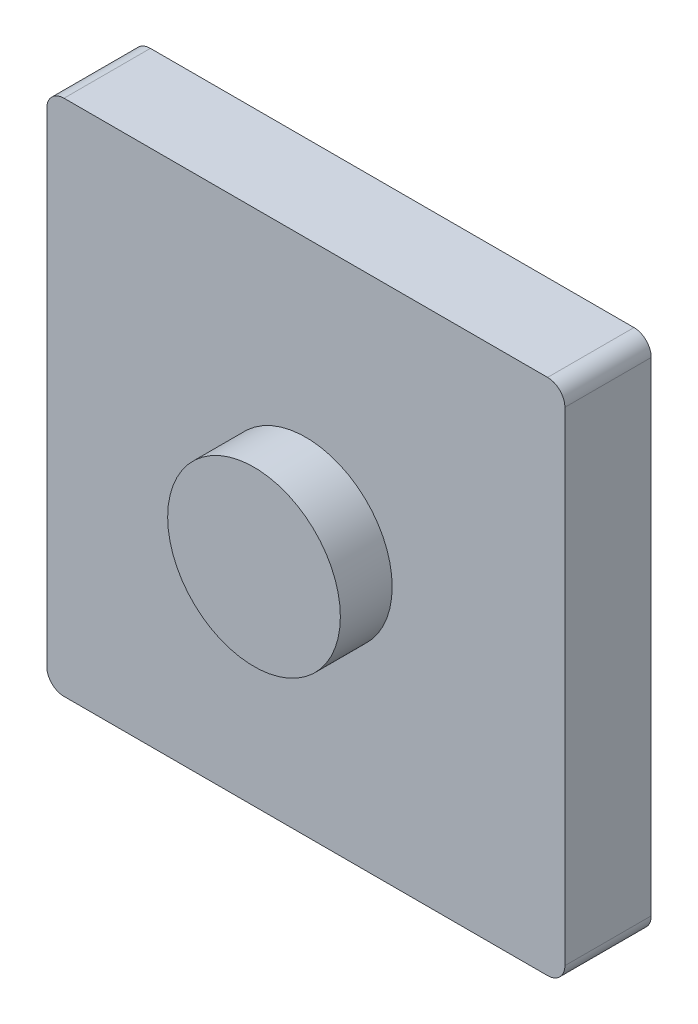
ISO-10303-21;
HEADER;
FILE_DESCRIPTION(('STEP AP214'),'2;1');
FILE_NAME('part.step','',(''),(''),'','','');
FILE_SCHEMA(('AUTOMOTIVE_DESIGN { 1 0 10303 214 1 1 1 1 }'));
ENDSEC;
DATA;
#1=APPLICATION_CONTEXT('core data for automotive mechanical design processes');
#2=APPLICATION_PROTOCOL_DEFINITION('international standard','automotive_design',2000,#1);
#3=PRODUCT_CONTEXT('',#1,'mechanical');
#4=PRODUCT('Part','Part','',(#3));
#5=PRODUCT_RELATED_PRODUCT_CATEGORY('part','',(#4));
#6=PRODUCT_DEFINITION_FORMATION('','',#4);
#7=PRODUCT_DEFINITION_CONTEXT('part definition',#1,'design');
#8=PRODUCT_DEFINITION('design','',#6,#7);
#9=PRODUCT_DEFINITION_SHAPE('','',#8);
#10=(LENGTH_UNIT() NAMED_UNIT(*) SI_UNIT(.MILLI.,.METRE.));
#11=(NAMED_UNIT(*) PLANE_ANGLE_UNIT() SI_UNIT($,.RADIAN.));
#12=(NAMED_UNIT(*) SI_UNIT($,.STERADIAN.) SOLID_ANGLE_UNIT());
#13=UNCERTAINTY_MEASURE_WITH_UNIT(LENGTH_MEASURE(1.E-05),#10,'distance_accuracy_value','');
#14=(GEOMETRIC_REPRESENTATION_CONTEXT(3) GLOBAL_UNCERTAINTY_ASSIGNED_CONTEXT((#13)) GLOBAL_UNIT_ASSIGNED_CONTEXT((#10,
#11,#12)) REPRESENTATION_CONTEXT('',''));
#15=CARTESIAN_POINT('',(0.,0.,0.));
#16=DIRECTION('',(0.,0.,1.));
#17=DIRECTION('',(1.,0.,0.));
#18=AXIS2_PLACEMENT_3D('',#15,#16,#17);
#19=CARTESIAN_POINT('',(1.,1.,5.));
#20=DIRECTION('',(0.,0.,-1.));
#21=DIRECTION('',(-1.,0.,0.));
#22=AXIS2_PLACEMENT_3D('',#19,#20,#21);
#23=CYLINDRICAL_SURFACE('',#22,1.);
#24=CARTESIAN_POINT('',(1.,1.,0.));
#25=DIRECTION('',(0.,0.,1.));
#26=DIRECTION('',(-1.,0.,0.));
#27=AXIS2_PLACEMENT_3D('',#24,#25,#26);
#28=CIRCLE('',#27,1.);
#29=CARTESIAN_POINT('',(0.,1.00000000000001,0.));
#30=VERTEX_POINT('',#29);
#31=CARTESIAN_POINT('',(1.00000000000001,0.,0.));
#32=VERTEX_POINT('',#31);
#33=EDGE_CURVE('E131',#30,#32,#28,.T.);
#34=ORIENTED_EDGE('',*,*,#33,.T.);
#35=DIRECTION('',(0.,0.,-1.));
#36=VECTOR('',#35,1.);
#37=CARTESIAN_POINT('',(1.00000000000001,0.,5.));
#38=LINE('',#37,#36);
#39=CARTESIAN_POINT('',(1.00000000000001,0.,5.));
#40=VERTEX_POINT('',#39);
#41=EDGE_CURVE('E42',#40,#32,#38,.T.);
#42=ORIENTED_EDGE('',*,*,#41,.F.);
#43=CARTESIAN_POINT('',(1.,1.,5.));
#44=DIRECTION('',(0.,0.,1.));
#45=DIRECTION('',(-1.,0.,0.));
#46=AXIS2_PLACEMENT_3D('',#43,#44,#45);
#47=CIRCLE('',#46,1.);
#48=CARTESIAN_POINT('',(0.,1.00000000000001,5.));
#49=VERTEX_POINT('',#48);
#50=EDGE_CURVE('E146',#49,#40,#47,.T.);
#51=ORIENTED_EDGE('',*,*,#50,.F.);
#52=DIRECTION('',(0.,0.,-1.));
#53=VECTOR('',#52,1.);
#54=CARTESIAN_POINT('',(0.,1.00000000000001,5.));
#55=LINE('',#54,#53);
#56=EDGE_CURVE('E127',#49,#30,#55,.T.);
#57=ORIENTED_EDGE('',*,*,#56,.T.);
#58=EDGE_LOOP('',(#34,#42,#51,#57));
#59=FACE_BOUND('',#58,.T.);
#60=ADVANCED_FACE('F34',(#59),#23,.T.);
#61=CARTESIAN_POINT('',(1.00000000000001,0.,5.));
#62=DIRECTION('',(0.,1.,0.));
#63=DIRECTION('',(0.,0.,1.));
#64=AXIS2_PLACEMENT_3D('',#61,#62,#63);
#65=PLANE('',#64);
#66=DIRECTION('',(1.,0.,0.));
#67=VECTOR('',#66,1.);
#68=CARTESIAN_POINT('',(1.00000000000001,0.,0.));
#69=LINE('',#68,#67);
#70=CARTESIAN_POINT('',(29.,0.,0.));
#71=VERTEX_POINT('',#70);
#72=EDGE_CURVE('E134',#32,#71,#69,.T.);
#73=ORIENTED_EDGE('',*,*,#72,.T.);
#74=DIRECTION('',(0.,0.,-1.));
#75=VECTOR('',#74,1.);
#76=CARTESIAN_POINT('',(29.,0.,5.));
#77=LINE('',#76,#75);
#78=CARTESIAN_POINT('',(29.,0.,5.));
#79=VERTEX_POINT('',#78);
#80=EDGE_CURVE('E156',#79,#71,#77,.T.);
#81=ORIENTED_EDGE('',*,*,#80,.F.);
#82=DIRECTION('',(1.,0.,0.));
#83=VECTOR('',#82,1.);
#84=CARTESIAN_POINT('',(1.00000000000001,0.,5.));
#85=LINE('',#84,#83);
#86=EDGE_CURVE('E94',#40,#79,#85,.T.);
#87=ORIENTED_EDGE('',*,*,#86,.F.);
#88=ORIENTED_EDGE('',*,*,#41,.T.);
#89=EDGE_LOOP('',(#73,#81,#87,#88));
#90=FACE_BOUND('',#89,.T.);
#91=ADVANCED_FACE('F159',(#90),#65,.F.);
#92=CARTESIAN_POINT('',(29.,1.,5.));
#93=DIRECTION('',(0.,0.,-1.));
#94=DIRECTION('',(-1.,0.,0.));
#95=AXIS2_PLACEMENT_3D('',#92,#93,#94);
#96=CYLINDRICAL_SURFACE('',#95,1.);
#97=CARTESIAN_POINT('',(29.,1.,0.));
#98=DIRECTION('',(0.,0.,1.));
#99=DIRECTION('',(1.,0.,0.));
#100=AXIS2_PLACEMENT_3D('',#97,#98,#99);
#101=CIRCLE('',#100,1.);
#102=CARTESIAN_POINT('',(30.,1.,0.));
#103=VERTEX_POINT('',#102);
#104=EDGE_CURVE('E137',#71,#103,#101,.T.);
#105=ORIENTED_EDGE('',*,*,#104,.T.);
#106=DIRECTION('',(0.,0.,-1.));
#107=VECTOR('',#106,1.);
#108=CARTESIAN_POINT('',(30.,1.,5.));
#109=LINE('',#108,#107);
#110=CARTESIAN_POINT('',(30.,1.,5.));
#111=VERTEX_POINT('',#110);
#112=EDGE_CURVE('E153',#111,#103,#109,.T.);
#113=ORIENTED_EDGE('',*,*,#112,.F.);
#114=CARTESIAN_POINT('',(29.,1.,5.));
#115=DIRECTION('',(0.,0.,1.));
#116=DIRECTION('',(1.,0.,0.));
#117=AXIS2_PLACEMENT_3D('',#114,#115,#116);
#118=CIRCLE('',#117,1.);
#119=EDGE_CURVE('E177',#79,#111,#118,.T.);
#120=ORIENTED_EDGE('',*,*,#119,.F.);
#121=ORIENTED_EDGE('',*,*,#80,.T.);
#122=EDGE_LOOP('',(#105,#113,#120,#121));
#123=FACE_BOUND('',#122,.T.);
#124=ADVANCED_FACE('F170',(#123),#96,.T.);
#125=CARTESIAN_POINT('',(30.,1.00000000000001,5.));
#126=DIRECTION('',(-1.,0.,0.));
#127=DIRECTION('',(0.,0.,1.));
#128=AXIS2_PLACEMENT_3D('',#125,#126,#127);
#129=PLANE('',#128);
#130=DIRECTION('',(0.,1.,0.));
#131=VECTOR('',#130,1.);
#132=CARTESIAN_POINT('',(30.,1.00000000000001,0.));
#133=LINE('',#132,#131);
#134=CARTESIAN_POINT('',(30.,29.,0.));
#135=VERTEX_POINT('',#134);
#136=EDGE_CURVE('E139',#103,#135,#133,.T.);
#137=ORIENTED_EDGE('',*,*,#136,.T.);
#138=DIRECTION('',(0.,0.,-1.));
#139=VECTOR('',#138,1.);
#140=CARTESIAN_POINT('',(30.,29.,5.));
#141=LINE('',#140,#139);
#142=CARTESIAN_POINT('',(30.,29.,5.));
#143=VERTEX_POINT('',#142);
#144=EDGE_CURVE('E150',#143,#135,#141,.T.);
#145=ORIENTED_EDGE('',*,*,#144,.F.);
#146=DIRECTION('',(0.,1.,0.));
#147=VECTOR('',#146,1.);
#148=CARTESIAN_POINT('',(30.,1.00000000000001,5.));
#149=LINE('',#148,#147);
#150=EDGE_CURVE('E176',#111,#143,#149,.T.);
#151=ORIENTED_EDGE('',*,*,#150,.F.);
#152=ORIENTED_EDGE('',*,*,#112,.T.);
#153=EDGE_LOOP('',(#137,#145,#151,#152));
#154=FACE_BOUND('',#153,.T.);
#155=ADVANCED_FACE('F174',(#154),#129,.F.);
#156=CARTESIAN_POINT('',(29.,29.,5.));
#157=DIRECTION('',(0.,0.,-1.));
#158=DIRECTION('',(-1.,0.,0.));
#159=AXIS2_PLACEMENT_3D('',#156,#157,#158);
#160=CYLINDRICAL_SURFACE('',#159,1.);
#161=CARTESIAN_POINT('',(29.,29.,0.));
#162=DIRECTION('',(0.,0.,1.));
#163=DIRECTION('',(-1.,0.,0.));
#164=AXIS2_PLACEMENT_3D('',#161,#162,#163);
#165=CIRCLE('',#164,1.);
#166=CARTESIAN_POINT('',(29.,30.,0.));
#167=VERTEX_POINT('',#166);
#168=EDGE_CURVE('E141',#135,#167,#165,.T.);
#169=ORIENTED_EDGE('',*,*,#168,.T.);
#170=DIRECTION('',(0.,0.,-1.));
#171=VECTOR('',#170,1.);
#172=CARTESIAN_POINT('',(29.,30.,5.));
#173=LINE('',#172,#171);
#174=CARTESIAN_POINT('',(29.,30.,5.));
#175=VERTEX_POINT('',#174);
#176=EDGE_CURVE('E122',#175,#167,#173,.T.);
#177=ORIENTED_EDGE('',*,*,#176,.F.);
#178=CARTESIAN_POINT('',(29.,29.,5.));
#179=DIRECTION('',(0.,0.,1.));
#180=DIRECTION('',(-1.,0.,0.));
#181=AXIS2_PLACEMENT_3D('',#178,#179,#180);
#182=CIRCLE('',#181,1.);
#183=EDGE_CURVE('E113',#143,#175,#182,.T.);
#184=ORIENTED_EDGE('',*,*,#183,.F.);
#185=ORIENTED_EDGE('',*,*,#144,.T.);
#186=EDGE_LOOP('',(#169,#177,#184,#185));
#187=FACE_BOUND('',#186,.T.);
#188=ADVANCED_FACE('F214',(#187),#160,.T.);
#189=CARTESIAN_POINT('',(1.00000000000001,30.,5.));
#190=DIRECTION('',(0.,-1.,0.));
#191=DIRECTION('',(0.,0.,-1.));
#192=AXIS2_PLACEMENT_3D('',#189,#190,#191);
#193=PLANE('',#192);
#194=DIRECTION('',(-1.,0.,0.));
#195=VECTOR('',#194,1.);
#196=CARTESIAN_POINT('',(1.00000000000001,30.,0.));
#197=LINE('',#196,#195);
#198=CARTESIAN_POINT('',(1.00000000000001,30.,0.));
#199=VERTEX_POINT('',#198);
#200=EDGE_CURVE('E121',#167,#199,#197,.T.);
#201=ORIENTED_EDGE('',*,*,#200,.T.);
#202=DIRECTION('',(0.,0.,-1.));
#203=VECTOR('',#202,1.);
#204=CARTESIAN_POINT('',(1.00000000000001,30.,5.));
#205=LINE('',#204,#203);
#206=CARTESIAN_POINT('',(1.00000000000001,30.,5.));
#207=VERTEX_POINT('',#206);
#208=EDGE_CURVE('E118',#207,#199,#205,.T.);
#209=ORIENTED_EDGE('',*,*,#208,.F.);
#210=DIRECTION('',(-1.,0.,0.));
#211=VECTOR('',#210,1.);
#212=CARTESIAN_POINT('',(1.00000000000001,30.,5.));
#213=LINE('',#212,#211);
#214=EDGE_CURVE('E107',#175,#207,#213,.T.);
#215=ORIENTED_EDGE('',*,*,#214,.F.);
#216=ORIENTED_EDGE('',*,*,#176,.T.);
#217=EDGE_LOOP('',(#201,#209,#215,#216));
#218=FACE_BOUND('',#217,.T.);
#219=ADVANCED_FACE('F119',(#218),#193,.F.);
#220=CARTESIAN_POINT('',(1.,29.,5.));
#221=DIRECTION('',(0.,0.,-1.));
#222=DIRECTION('',(-1.,0.,0.));
#223=AXIS2_PLACEMENT_3D('',#220,#221,#222);
#224=CYLINDRICAL_SURFACE('',#223,1.);
#225=CARTESIAN_POINT('',(1.,29.,0.));
#226=DIRECTION('',(0.,0.,1.));
#227=DIRECTION('',(-1.,0.,0.));
#228=AXIS2_PLACEMENT_3D('',#225,#226,#227);
#229=CIRCLE('',#228,1.);
#230=CARTESIAN_POINT('',(0.,29.,0.));
#231=VERTEX_POINT('',#230);
#232=EDGE_CURVE('E79',#199,#231,#229,.T.);
#233=ORIENTED_EDGE('',*,*,#232,.T.);
#234=DIRECTION('',(0.,0.,-1.));
#235=VECTOR('',#234,1.);
#236=CARTESIAN_POINT('',(0.,29.,5.));
#237=LINE('',#236,#235);
#238=CARTESIAN_POINT('',(0.,29.,5.));
#239=VERTEX_POINT('',#238);
#240=EDGE_CURVE('E123',#239,#231,#237,.T.);
#241=ORIENTED_EDGE('',*,*,#240,.F.);
#242=CARTESIAN_POINT('',(1.,29.,5.));
#243=DIRECTION('',(0.,0.,1.));
#244=DIRECTION('',(-1.,0.,0.));
#245=AXIS2_PLACEMENT_3D('',#242,#243,#244);
#246=CIRCLE('',#245,1.);
#247=EDGE_CURVE('E111',#207,#239,#246,.T.);
#248=ORIENTED_EDGE('',*,*,#247,.F.);
#249=ORIENTED_EDGE('',*,*,#208,.T.);
#250=EDGE_LOOP('',(#233,#241,#248,#249));
#251=FACE_BOUND('',#250,.T.);
#252=ADVANCED_FACE('F125',(#251),#224,.T.);
#253=CARTESIAN_POINT('',(0.,1.00000000000001,5.));
#254=DIRECTION('',(1.,0.,0.));
#255=DIRECTION('',(0.,0.,-1.));
#256=AXIS2_PLACEMENT_3D('',#253,#254,#255);
#257=PLANE('',#256);
#258=DIRECTION('',(0.,-1.,0.));
#259=VECTOR('',#258,1.);
#260=CARTESIAN_POINT('',(0.,1.00000000000001,0.));
#261=LINE('',#260,#259);
#262=EDGE_CURVE('E85',#231,#30,#261,.T.);
#263=ORIENTED_EDGE('',*,*,#262,.T.);
#264=ORIENTED_EDGE('',*,*,#56,.F.);
#265=DIRECTION('',(0.,-1.,0.));
#266=VECTOR('',#265,1.);
#267=CARTESIAN_POINT('',(0.,1.00000000000001,5.));
#268=LINE('',#267,#266);
#269=EDGE_CURVE('E50',#239,#49,#268,.T.);
#270=ORIENTED_EDGE('',*,*,#269,.F.);
#271=ORIENTED_EDGE('',*,*,#240,.T.);
#272=EDGE_LOOP('',(#263,#264,#270,#271));
#273=FACE_BOUND('',#272,.T.);
#274=ADVANCED_FACE('F195',(#273),#257,.F.);
#275=CARTESIAN_POINT('',(1.,1.,5.));
#276=DIRECTION('',(0.,0.,-1.));
#277=DIRECTION('',(-1.,0.,0.));
#278=AXIS2_PLACEMENT_3D('',#275,#276,#277);
#279=PLANE('',#278);
#280=CARTESIAN_POINT('',(15.,15.,5.));
#281=DIRECTION('',(0.,0.,-1.));
#282=DIRECTION('',(-1.,0.,0.));
#283=AXIS2_PLACEMENT_3D('',#280,#281,#282);
#284=CIRCLE('',#283,5.);
#285=CARTESIAN_POINT('',(10.,15.,5.));
#286=VERTEX_POINT('',#285);
#287=EDGE_CURVE('E11',#286,#286,#284,.F.);
#288=ORIENTED_EDGE('',*,*,#287,.F.);
#289=EDGE_LOOP('',(#288));
#290=FACE_BOUND('',#289,.T.);
#291=ORIENTED_EDGE('',*,*,#50,.T.);
#292=ORIENTED_EDGE('',*,*,#86,.T.);
#293=ORIENTED_EDGE('',*,*,#119,.T.);
#294=ORIENTED_EDGE('',*,*,#150,.T.);
#295=ORIENTED_EDGE('',*,*,#183,.T.);
#296=ORIENTED_EDGE('',*,*,#214,.T.);
#297=ORIENTED_EDGE('',*,*,#247,.T.);
#298=ORIENTED_EDGE('',*,*,#269,.T.);
#299=EDGE_LOOP('',(#291,#292,#293,#294,#295,#296,#297,#298));
#300=FACE_BOUND('',#299,.T.);
#301=ADVANCED_FACE('F109',(#290,#300),#279,.F.);
#302=CARTESIAN_POINT('',(1.,1.,0.));
#303=DIRECTION('',(0.,0.,-1.));
#304=DIRECTION('',(-1.,0.,0.));
#305=AXIS2_PLACEMENT_3D('',#302,#303,#304);
#306=PLANE('',#305);
#307=ORIENTED_EDGE('',*,*,#33,.F.);
#308=ORIENTED_EDGE('',*,*,#262,.F.);
#309=ORIENTED_EDGE('',*,*,#232,.F.);
#310=ORIENTED_EDGE('',*,*,#200,.F.);
#311=ORIENTED_EDGE('',*,*,#168,.F.);
#312=ORIENTED_EDGE('',*,*,#136,.F.);
#313=ORIENTED_EDGE('',*,*,#104,.F.);
#314=ORIENTED_EDGE('',*,*,#72,.F.);
#315=EDGE_LOOP('',(#307,#308,#309,#310,#311,#312,#313,#314));
#316=FACE_BOUND('',#315,.T.);
#317=ADVANCED_FACE('F164',(#316),#306,.T.);
#318=CARTESIAN_POINT('',(15.,15.,8.));
#319=DIRECTION('',(0.,0.,-1.));
#320=DIRECTION('',(-1.,0.,0.));
#321=AXIS2_PLACEMENT_3D('',#318,#319,#320);
#322=CYLINDRICAL_SURFACE('',#321,5.);
#323=CARTESIAN_POINT('',(15.,15.,8.));
#324=DIRECTION('',(0.,0.,1.));
#325=DIRECTION('',(1.,0.,0.));
#326=AXIS2_PLACEMENT_3D('',#323,#324,#325);
#327=CIRCLE('',#326,5.);
#328=CARTESIAN_POINT('',(20.,15.,8.));
#329=VERTEX_POINT('',#328);
#330=EDGE_CURVE('E135',#329,#329,#327,.T.);
#331=ORIENTED_EDGE('',*,*,#330,.F.);
#332=EDGE_LOOP('',(#331));
#333=FACE_BOUND('',#332,.T.);
#334=ORIENTED_EDGE('',*,*,#287,.T.);
#335=EDGE_LOOP('',(#334));
#336=FACE_BOUND('',#335,.T.);
#337=ADVANCED_FACE('F188',(#333,#336),#322,.T.);
#338=CARTESIAN_POINT('',(15.,15.,8.));
#339=DIRECTION('',(0.,0.,1.));
#340=DIRECTION('',(1.,0.,0.));
#341=AXIS2_PLACEMENT_3D('',#338,#339,#340);
#342=PLANE('',#341);
#343=ORIENTED_EDGE('',*,*,#330,.T.);
#344=EDGE_LOOP('',(#343));
#345=FACE_BOUND('',#344,.T.);
#346=ADVANCED_FACE('F186',(#345),#342,.T.);
#347=CLOSED_SHELL('',(#60,#91,#124,#155,#188,#219,#252,#274,#301,#317,#337,#346));
#348=MANIFOLD_SOLID_BREP('B2',#347);
#349=ADVANCED_BREP_SHAPE_REPRESENTATION('',(#18,#348),#14);
#350=SHAPE_DEFINITION_REPRESENTATION(#9,#349);
ENDSEC;
END-ISO-10303-21;
